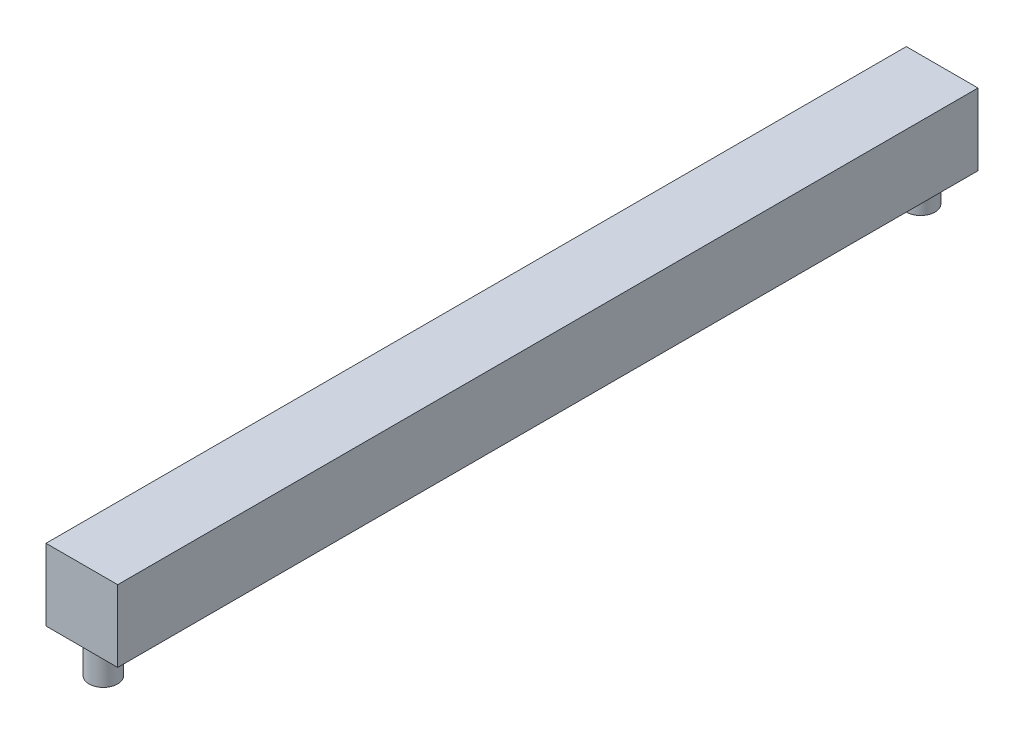
ISO-10303-21;
HEADER;
FILE_DESCRIPTION(('STEP AP214'),'2;1');
FILE_NAME('part.step','',(''),(''),'','','');
FILE_SCHEMA(('AUTOMOTIVE_DESIGN { 1 0 10303 214 1 1 1 1 }'));
ENDSEC;
DATA;
#1=APPLICATION_CONTEXT('core data for automotive mechanical design processes');
#2=APPLICATION_PROTOCOL_DEFINITION('international standard','automotive_design',2000,#1);
#3=PRODUCT_CONTEXT('',#1,'mechanical');
#4=PRODUCT('Part','Part','',(#3));
#5=PRODUCT_RELATED_PRODUCT_CATEGORY('part','',(#4));
#6=PRODUCT_DEFINITION_FORMATION('','',#4);
#7=PRODUCT_DEFINITION_CONTEXT('part definition',#1,'design');
#8=PRODUCT_DEFINITION('design','',#6,#7);
#9=PRODUCT_DEFINITION_SHAPE('','',#8);
#10=(LENGTH_UNIT() NAMED_UNIT(*) SI_UNIT(.MILLI.,.METRE.));
#11=(NAMED_UNIT(*) PLANE_ANGLE_UNIT() SI_UNIT($,.RADIAN.));
#12=(NAMED_UNIT(*) SI_UNIT($,.STERADIAN.) SOLID_ANGLE_UNIT());
#13=UNCERTAINTY_MEASURE_WITH_UNIT(LENGTH_MEASURE(1.E-05),#10,'distance_accuracy_value','');
#14=(GEOMETRIC_REPRESENTATION_CONTEXT(3) GLOBAL_UNCERTAINTY_ASSIGNED_CONTEXT((#13)) GLOBAL_UNIT_ASSIGNED_CONTEXT((#10,
#11,#12)) REPRESENTATION_CONTEXT('',''));
#15=CARTESIAN_POINT('',(0.,0.,0.));
#16=DIRECTION('',(0.,0.,1.));
#17=DIRECTION('',(1.,0.,0.));
#18=AXIS2_PLACEMENT_3D('',#15,#16,#17);
#19=CARTESIAN_POINT('',(-3.39441414858727,10.,-52.3601166005291));
#20=DIRECTION('',(1.,0.,0.));
#21=DIRECTION('',(0.,0.,-1.));
#22=AXIS2_PLACEMENT_3D('',#19,#20,#21);
#23=PLANE('',#22);
#24=DIRECTION('',(0.,0.,1.));
#25=VECTOR('',#24,1.);
#26=CARTESIAN_POINT('',(-3.39441414858727,0.,-52.3601166005291));
#27=LINE('',#26,#25);
#28=CARTESIAN_POINT('',(-3.39441414858727,0.,-52.3601166005291));
#29=VERTEX_POINT('',#28);
#30=CARTESIAN_POINT('',(-3.39441414858726,0.,67.6398833994709));
#31=VERTEX_POINT('',#30);
#32=EDGE_CURVE('E100',#29,#31,#27,.T.);
#33=ORIENTED_EDGE('',*,*,#32,.T.);
#34=DIRECTION('',(0.,-1.,0.));
#35=VECTOR('',#34,1.);
#36=CARTESIAN_POINT('',(-3.39441414858726,10.,67.6398833994709));
#37=LINE('',#36,#35);
#38=CARTESIAN_POINT('',(-3.39441414858726,10.,67.6398833994709));
#39=VERTEX_POINT('',#38);
#40=EDGE_CURVE('E91',#39,#31,#37,.T.);
#41=ORIENTED_EDGE('',*,*,#40,.F.);
#42=DIRECTION('',(0.,0.,1.));
#43=VECTOR('',#42,1.);
#44=CARTESIAN_POINT('',(-3.39441414858727,10.,-52.3601166005291));
#45=LINE('',#44,#43);
#46=CARTESIAN_POINT('',(-3.39441414858727,10.,-52.3601166005291));
#47=VERTEX_POINT('',#46);
#48=EDGE_CURVE('E85',#47,#39,#45,.T.);
#49=ORIENTED_EDGE('',*,*,#48,.F.);
#50=DIRECTION('',(0.,-1.,0.));
#51=VECTOR('',#50,1.);
#52=CARTESIAN_POINT('',(-3.39441414858727,10.,-52.3601166005291));
#53=LINE('',#52,#51);
#54=EDGE_CURVE('E96',#47,#29,#53,.T.);
#55=ORIENTED_EDGE('',*,*,#54,.T.);
#56=EDGE_LOOP('',(#33,#41,#49,#55));
#57=FACE_BOUND('',#56,.T.);
#58=ADVANCED_FACE('F33',(#57),#23,.F.);
#59=CARTESIAN_POINT('',(-3.39441414858726,10.,67.6398833994709));
#60=DIRECTION('',(0.,0.,-1.));
#61=DIRECTION('',(-1.,0.,0.));
#62=AXIS2_PLACEMENT_3D('',#59,#60,#61);
#63=PLANE('',#62);
#64=DIRECTION('',(1.,0.,0.));
#65=VECTOR('',#64,1.);
#66=CARTESIAN_POINT('',(-3.39441414858726,0.,67.6398833994709));
#67=LINE('',#66,#65);
#68=CARTESIAN_POINT('',(6.60558585141274,0.,67.6398833994709));
#69=VERTEX_POINT('',#68);
#70=EDGE_CURVE('E90',#31,#69,#67,.T.);
#71=ORIENTED_EDGE('',*,*,#70,.T.);
#72=DIRECTION('',(0.,-1.,0.));
#73=VECTOR('',#72,1.);
#74=CARTESIAN_POINT('',(6.60558585141274,10.,67.6398833994709));
#75=LINE('',#74,#73);
#76=CARTESIAN_POINT('',(6.60558585141274,10.,67.6398833994709));
#77=VERTEX_POINT('',#76);
#78=EDGE_CURVE('E88',#77,#69,#75,.T.);
#79=ORIENTED_EDGE('',*,*,#78,.F.);
#80=DIRECTION('',(1.,0.,0.));
#81=VECTOR('',#80,1.);
#82=CARTESIAN_POINT('',(-3.39441414858726,10.,67.6398833994709));
#83=LINE('',#82,#81);
#84=EDGE_CURVE('E80',#39,#77,#83,.T.);
#85=ORIENTED_EDGE('',*,*,#84,.F.);
#86=ORIENTED_EDGE('',*,*,#40,.T.);
#87=EDGE_LOOP('',(#71,#79,#85,#86));
#88=FACE_BOUND('',#87,.T.);
#89=ADVANCED_FACE('F89',(#88),#63,.F.);
#90=CARTESIAN_POINT('',(6.60558585141273,10.,-52.3601166005291));
#91=DIRECTION('',(-1.,0.,0.));
#92=DIRECTION('',(0.,0.,1.));
#93=AXIS2_PLACEMENT_3D('',#90,#91,#92);
#94=PLANE('',#93);
#95=DIRECTION('',(0.,0.,-1.));
#96=VECTOR('',#95,1.);
#97=CARTESIAN_POINT('',(6.60558585141273,0.,-52.3601166005291));
#98=LINE('',#97,#96);
#99=CARTESIAN_POINT('',(6.60558585141273,0.,-52.3601166005291));
#100=VERTEX_POINT('',#99);
#101=EDGE_CURVE('E66',#69,#100,#98,.T.);
#102=ORIENTED_EDGE('',*,*,#101,.T.);
#103=DIRECTION('',(0.,-1.,0.));
#104=VECTOR('',#103,1.);
#105=CARTESIAN_POINT('',(6.60558585141273,10.,-52.3601166005291));
#106=LINE('',#105,#104);
#107=CARTESIAN_POINT('',(6.60558585141273,10.,-52.3601166005291));
#108=VERTEX_POINT('',#107);
#109=EDGE_CURVE('E92',#108,#100,#106,.T.);
#110=ORIENTED_EDGE('',*,*,#109,.F.);
#111=DIRECTION('',(0.,0.,-1.));
#112=VECTOR('',#111,1.);
#113=CARTESIAN_POINT('',(6.60558585141273,10.,-52.3601166005291));
#114=LINE('',#113,#112);
#115=EDGE_CURVE('E83',#77,#108,#114,.T.);
#116=ORIENTED_EDGE('',*,*,#115,.F.);
#117=ORIENTED_EDGE('',*,*,#78,.T.);
#118=EDGE_LOOP('',(#102,#110,#116,#117));
#119=FACE_BOUND('',#118,.T.);
#120=ADVANCED_FACE('F94',(#119),#94,.F.);
#121=CARTESIAN_POINT('',(-3.39441414858727,10.,-52.3601166005291));
#122=DIRECTION('',(0.,0.,1.));
#123=DIRECTION('',(1.,0.,0.));
#124=AXIS2_PLACEMENT_3D('',#121,#122,#123);
#125=PLANE('',#124);
#126=DIRECTION('',(-1.,0.,0.));
#127=VECTOR('',#126,1.);
#128=CARTESIAN_POINT('',(-3.39441414858727,0.,-52.3601166005291));
#129=LINE('',#128,#127);
#130=EDGE_CURVE('E72',#100,#29,#129,.T.);
#131=ORIENTED_EDGE('',*,*,#130,.T.);
#132=ORIENTED_EDGE('',*,*,#54,.F.);
#133=DIRECTION('',(-1.,0.,0.));
#134=VECTOR('',#133,1.);
#135=CARTESIAN_POINT('',(-3.39441414858727,10.,-52.3601166005291));
#136=LINE('',#135,#134);
#137=EDGE_CURVE('E49',#108,#47,#136,.T.);
#138=ORIENTED_EDGE('',*,*,#137,.F.);
#139=ORIENTED_EDGE('',*,*,#109,.T.);
#140=EDGE_LOOP('',(#131,#132,#138,#139));
#141=FACE_BOUND('',#140,.T.);
#142=ADVANCED_FACE('F121',(#141),#125,.F.);
#143=CARTESIAN_POINT('',(0.,10.,0.));
#144=DIRECTION('',(0.,1.,0.));
#145=DIRECTION('',(0.,0.,1.));
#146=AXIS2_PLACEMENT_3D('',#143,#144,#145);
#147=PLANE('',#146);
#148=ORIENTED_EDGE('',*,*,#48,.T.);
#149=ORIENTED_EDGE('',*,*,#84,.T.);
#150=ORIENTED_EDGE('',*,*,#115,.T.);
#151=ORIENTED_EDGE('',*,*,#137,.T.);
#152=EDGE_LOOP('',(#148,#149,#150,#151));
#153=FACE_BOUND('',#152,.T.);
#154=ADVANCED_FACE('F81',(#153),#147,.T.);
#155=CARTESIAN_POINT('',(0.,0.,0.));
#156=DIRECTION('',(0.,1.,0.));
#157=DIRECTION('',(0.,0.,1.));
#158=AXIS2_PLACEMENT_3D('',#155,#156,#157);
#159=PLANE('',#158);
#160=CARTESIAN_POINT('',(1.60558585141274,0.,64.6398833994709));
#161=DIRECTION('',(0.,1.,0.));
#162=DIRECTION('',(0.,0.,1.));
#163=AXIS2_PLACEMENT_3D('',#160,#161,#162);
#164=CIRCLE('',#163,2.);
#165=CARTESIAN_POINT('',(1.60558585141274,0.,66.6398833994709));
#166=VERTEX_POINT('',#165);
#167=EDGE_CURVE('E11',#166,#166,#164,.F.);
#168=ORIENTED_EDGE('',*,*,#167,.F.);
#169=EDGE_LOOP('',(#168));
#170=FACE_BOUND('',#169,.T.);
#171=CARTESIAN_POINT('',(1.60558585141273,0.,-49.3601166005291));
#172=DIRECTION('',(0.,1.,0.));
#173=DIRECTION('',(0.,0.,1.));
#174=AXIS2_PLACEMENT_3D('',#171,#172,#173);
#175=CIRCLE('',#174,2.);
#176=CARTESIAN_POINT('',(1.60558585141273,0.,-47.3601166005291));
#177=VERTEX_POINT('',#176);
#178=EDGE_CURVE('E41',#177,#177,#175,.F.);
#179=ORIENTED_EDGE('',*,*,#178,.F.);
#180=EDGE_LOOP('',(#179));
#181=FACE_BOUND('',#180,.T.);
#182=ORIENTED_EDGE('',*,*,#32,.F.);
#183=ORIENTED_EDGE('',*,*,#130,.F.);
#184=ORIENTED_EDGE('',*,*,#101,.F.);
#185=ORIENTED_EDGE('',*,*,#70,.F.);
#186=EDGE_LOOP('',(#182,#183,#184,#185));
#187=FACE_BOUND('',#186,.T.);
#188=ADVANCED_FACE('F114',(#170,#181,#187),#159,.F.);
#189=CARTESIAN_POINT('',(1.60558585141273,-5.,-49.3601166005291));
#190=DIRECTION('',(0.,1.,0.));
#191=DIRECTION('',(0.,0.,1.));
#192=AXIS2_PLACEMENT_3D('',#189,#190,#191);
#193=CYLINDRICAL_SURFACE('',#192,2.);
#194=CARTESIAN_POINT('',(1.60558585141273,-5.,-49.3601166005291));
#195=DIRECTION('',(0.,-1.,0.));
#196=DIRECTION('',(0.,0.,-1.));
#197=AXIS2_PLACEMENT_3D('',#194,#195,#196);
#198=CIRCLE('',#197,2.);
#199=CARTESIAN_POINT('',(1.60558585141273,-5.,-51.3601166005291));
#200=VERTEX_POINT('',#199);
#201=EDGE_CURVE('E103',#200,#200,#198,.T.);
#202=ORIENTED_EDGE('',*,*,#201,.F.);
#203=EDGE_LOOP('',(#202));
#204=FACE_BOUND('',#203,.T.);
#205=ORIENTED_EDGE('',*,*,#178,.T.);
#206=EDGE_LOOP('',(#205));
#207=FACE_BOUND('',#206,.T.);
#208=ADVANCED_FACE('F112',(#204,#207),#193,.T.);
#209=CARTESIAN_POINT('',(1.60558585141273,-5.,-49.3601166005291));
#210=DIRECTION('',(0.,-1.,0.));
#211=DIRECTION('',(0.,0.,-1.));
#212=AXIS2_PLACEMENT_3D('',#209,#210,#211);
#213=PLANE('',#212);
#214=ORIENTED_EDGE('',*,*,#201,.T.);
#215=EDGE_LOOP('',(#214));
#216=FACE_BOUND('',#215,.T.);
#217=ADVANCED_FACE('F165',(#216),#213,.T.);
#218=CARTESIAN_POINT('',(1.60558585141274,-5.,64.6398833994709));
#219=DIRECTION('',(0.,1.,0.));
#220=DIRECTION('',(0.,0.,1.));
#221=AXIS2_PLACEMENT_3D('',#218,#219,#220);
#222=CYLINDRICAL_SURFACE('',#221,2.);
#223=CARTESIAN_POINT('',(1.60558585141274,-5.,64.6398833994709));
#224=DIRECTION('',(0.,-1.,0.));
#225=DIRECTION('',(0.,0.,-1.));
#226=AXIS2_PLACEMENT_3D('',#223,#224,#225);
#227=CIRCLE('',#226,2.);
#228=CARTESIAN_POINT('',(1.60558585141274,-5.,62.6398833994709));
#229=VERTEX_POINT('',#228);
#230=EDGE_CURVE('E201',#229,#229,#227,.T.);
#231=ORIENTED_EDGE('',*,*,#230,.F.);
#232=EDGE_LOOP('',(#231));
#233=FACE_BOUND('',#232,.T.);
#234=ORIENTED_EDGE('',*,*,#167,.T.);
#235=EDGE_LOOP('',(#234));
#236=FACE_BOUND('',#235,.T.);
#237=ADVANCED_FACE('F175',(#233,#236),#222,.T.);
#238=CARTESIAN_POINT('',(1.60558585141274,-5.,64.6398833994709));
#239=DIRECTION('',(0.,-1.,0.));
#240=DIRECTION('',(0.,0.,-1.));
#241=AXIS2_PLACEMENT_3D('',#238,#239,#240);
#242=PLANE('',#241);
#243=ORIENTED_EDGE('',*,*,#230,.T.);
#244=EDGE_LOOP('',(#243));
#245=FACE_BOUND('',#244,.T.);
#246=ADVANCED_FACE('F185',(#245),#242,.T.);
#247=CLOSED_SHELL('',(#58,#89,#120,#142,#154,#188,#208,#217,#237,#246));
#248=MANIFOLD_SOLID_BREP('B2',#247);
#249=ADVANCED_BREP_SHAPE_REPRESENTATION('',(#18,#248),#14);
#250=SHAPE_DEFINITION_REPRESENTATION(#9,#249);
ENDSEC;
END-ISO-10303-21;
